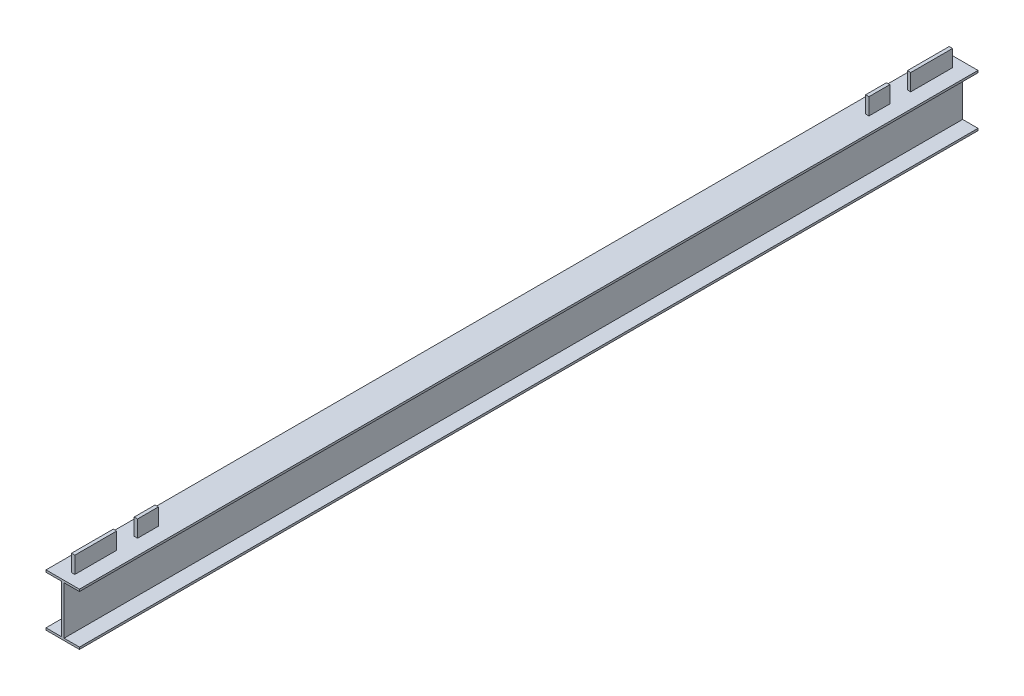
ISO-10303-21;
HEADER;
FILE_DESCRIPTION(('STEP AP214'),'2;1');
FILE_NAME('part.step','',(''),(''),'','','');
FILE_SCHEMA(('AUTOMOTIVE_DESIGN { 1 0 10303 214 1 1 1 1 }'));
ENDSEC;
DATA;
#1=APPLICATION_CONTEXT('core data for automotive mechanical design processes');
#2=APPLICATION_PROTOCOL_DEFINITION('international standard','automotive_design',2000,#1);
#3=PRODUCT_CONTEXT('',#1,'mechanical');
#4=PRODUCT('Part','Part','',(#3));
#5=PRODUCT_RELATED_PRODUCT_CATEGORY('part','',(#4));
#6=PRODUCT_DEFINITION_FORMATION('','',#4);
#7=PRODUCT_DEFINITION_CONTEXT('part definition',#1,'design');
#8=PRODUCT_DEFINITION('design','',#6,#7);
#9=PRODUCT_DEFINITION_SHAPE('','',#8);
#10=(LENGTH_UNIT() NAMED_UNIT(*) SI_UNIT(.MILLI.,.METRE.));
#11=(NAMED_UNIT(*) PLANE_ANGLE_UNIT() SI_UNIT($,.RADIAN.));
#12=(NAMED_UNIT(*) SI_UNIT($,.STERADIAN.) SOLID_ANGLE_UNIT());
#13=UNCERTAINTY_MEASURE_WITH_UNIT(LENGTH_MEASURE(1.E-05),#10,'distance_accuracy_value','');
#14=(GEOMETRIC_REPRESENTATION_CONTEXT(3) GLOBAL_UNCERTAINTY_ASSIGNED_CONTEXT((#13)) GLOBAL_UNIT_ASSIGNED_CONTEXT((#10,
#11,#12)) REPRESENTATION_CONTEXT('',''));
#15=CARTESIAN_POINT('',(0.,0.,0.));
#16=DIRECTION('',(0.,0.,1.));
#17=DIRECTION('',(1.,0.,0.));
#18=AXIS2_PLACEMENT_3D('',#15,#16,#17);
#19=CARTESIAN_POINT('',(0.,250.,4300.));
#20=DIRECTION('',(0.,-1.,0.));
#21=DIRECTION('',(0.,0.,-1.));
#22=AXIS2_PLACEMENT_3D('',#19,#20,#21);
#23=PLANE('',#22);
#24=DIRECTION('',(0.,0.,1.));
#25=VECTOR('',#24,1.);
#26=CARTESIAN_POINT('',(72.,250.,4050.));
#27=LINE('',#26,#25);
#28=CARTESIAN_POINT('',(72.,250.,4050.));
#29=VERTEX_POINT('',#28);
#30=CARTESIAN_POINT('',(72.,250.,4250.));
#31=VERTEX_POINT('',#30);
#32=EDGE_CURVE('E240',#29,#31,#27,.T.);
#33=ORIENTED_EDGE('',*,*,#32,.F.);
#34=DIRECTION('',(-1.,0.,0.));
#35=VECTOR('',#34,1.);
#36=CARTESIAN_POINT('',(72.,250.,4050.));
#37=LINE('',#36,#35);
#38=CARTESIAN_POINT('',(88.,250.,4050.));
#39=VERTEX_POINT('',#38);
#40=EDGE_CURVE('E253',#39,#29,#37,.T.);
#41=ORIENTED_EDGE('',*,*,#40,.F.);
#42=DIRECTION('',(0.,0.,-1.));
#43=VECTOR('',#42,1.);
#44=CARTESIAN_POINT('',(88.,250.,4050.));
#45=LINE('',#44,#43);
#46=CARTESIAN_POINT('',(88.,250.,4250.));
#47=VERTEX_POINT('',#46);
#48=EDGE_CURVE('E262',#47,#39,#45,.T.);
#49=ORIENTED_EDGE('',*,*,#48,.F.);
#50=DIRECTION('',(1.,0.,0.));
#51=VECTOR('',#50,1.);
#52=CARTESIAN_POINT('',(72.,250.,4250.));
#53=LINE('',#52,#51);
#54=EDGE_CURVE('E243',#31,#47,#53,.T.);
#55=ORIENTED_EDGE('',*,*,#54,.F.);
#56=EDGE_LOOP('',(#33,#41,#49,#55));
#57=FACE_BOUND('',#56,.T.);
#58=DIRECTION('',(0.,0.,1.));
#59=VECTOR('',#58,1.);
#60=CARTESIAN_POINT('',(71.9999999999996,250.,50.));
#61=LINE('',#60,#59);
#62=CARTESIAN_POINT('',(71.9999999999996,250.,50.));
#63=VERTEX_POINT('',#62);
#64=CARTESIAN_POINT('',(71.9999999999996,250.,250.));
#65=VERTEX_POINT('',#64);
#66=EDGE_CURVE('E311',#63,#65,#61,.T.);
#67=ORIENTED_EDGE('',*,*,#66,.F.);
#68=DIRECTION('',(-1.,0.,0.));
#69=VECTOR('',#68,1.);
#70=CARTESIAN_POINT('',(71.9999999999996,250.,50.));
#71=LINE('',#70,#69);
#72=CARTESIAN_POINT('',(88.0000000000004,250.,49.9999999999998));
#73=VERTEX_POINT('',#72);
#74=EDGE_CURVE('E316',#73,#63,#71,.T.);
#75=ORIENTED_EDGE('',*,*,#74,.F.);
#76=DIRECTION('',(0.,0.,-1.));
#77=VECTOR('',#76,1.);
#78=CARTESIAN_POINT('',(88.0000000000004,250.,50.));
#79=LINE('',#78,#77);
#80=CARTESIAN_POINT('',(88.0000000000004,250.,250.));
#81=VERTEX_POINT('',#80);
#82=EDGE_CURVE('E328',#81,#73,#79,.T.);
#83=ORIENTED_EDGE('',*,*,#82,.F.);
#84=DIRECTION('',(1.,0.,0.));
#85=VECTOR('',#84,1.);
#86=CARTESIAN_POINT('',(71.9999999999996,250.,250.));
#87=LINE('',#86,#85);
#88=EDGE_CURVE('E325',#65,#81,#87,.T.);
#89=ORIENTED_EDGE('',*,*,#88,.F.);
#90=EDGE_LOOP('',(#67,#75,#83,#89));
#91=FACE_BOUND('',#90,.T.);
#92=DIRECTION('',(-1.,0.,0.));
#93=VECTOR('',#92,1.);
#94=CARTESIAN_POINT('',(0.,250.,0.));
#95=LINE('',#94,#93);
#96=CARTESIAN_POINT('',(160.,250.,0.));
#97=VERTEX_POINT('',#96);
#98=CARTESIAN_POINT('',(0.,250.,0.));
#99=VERTEX_POINT('',#98);
#100=EDGE_CURVE('E419',#97,#99,#95,.T.);
#101=ORIENTED_EDGE('',*,*,#100,.T.);
#102=DIRECTION('',(0.,0.,-1.));
#103=VECTOR('',#102,1.);
#104=CARTESIAN_POINT('',(0.,250.,4300.));
#105=LINE('',#104,#103);
#106=CARTESIAN_POINT('',(0.,250.,4300.));
#107=VERTEX_POINT('',#106);
#108=EDGE_CURVE('E409',#107,#99,#105,.T.);
#109=ORIENTED_EDGE('',*,*,#108,.F.);
#110=DIRECTION('',(-1.,0.,0.));
#111=VECTOR('',#110,1.);
#112=CARTESIAN_POINT('',(0.,250.,4300.));
#113=LINE('',#112,#111);
#114=CARTESIAN_POINT('',(160.,250.,4300.));
#115=VERTEX_POINT('',#114);
#116=EDGE_CURVE('E407',#115,#107,#113,.T.);
#117=ORIENTED_EDGE('',*,*,#116,.F.);
#118=DIRECTION('',(0.,0.,-1.));
#119=VECTOR('',#118,1.);
#120=CARTESIAN_POINT('',(160.,250.,4300.));
#121=LINE('',#120,#119);
#122=EDGE_CURVE('E423',#115,#97,#121,.T.);
#123=ORIENTED_EDGE('',*,*,#122,.T.);
#124=EDGE_LOOP('',(#101,#109,#117,#123));
#125=FACE_BOUND('',#124,.T.);
#126=DIRECTION('',(0.,0.,1.));
#127=VECTOR('',#126,1.);
#128=CARTESIAN_POINT('',(71.9999999999996,250.,350.));
#129=LINE('',#128,#127);
#130=CARTESIAN_POINT('',(71.9999999999996,250.,350.));
#131=VERTEX_POINT('',#130);
#132=CARTESIAN_POINT('',(71.9999999999996,250.,450.));
#133=VERTEX_POINT('',#132);
#134=EDGE_CURVE('E278',#131,#133,#129,.T.);
#135=ORIENTED_EDGE('',*,*,#134,.F.);
#136=DIRECTION('',(-1.,0.,0.));
#137=VECTOR('',#136,1.);
#138=CARTESIAN_POINT('',(71.9999999999996,250.,350.));
#139=LINE('',#138,#137);
#140=CARTESIAN_POINT('',(88.0000000000004,250.,350.));
#141=VERTEX_POINT('',#140);
#142=EDGE_CURVE('E283',#141,#131,#139,.T.);
#143=ORIENTED_EDGE('',*,*,#142,.F.);
#144=DIRECTION('',(0.,0.,-1.));
#145=VECTOR('',#144,1.);
#146=CARTESIAN_POINT('',(88.0000000000004,250.,350.));
#147=LINE('',#146,#145);
#148=CARTESIAN_POINT('',(88.0000000000004,250.,450.));
#149=VERTEX_POINT('',#148);
#150=EDGE_CURVE('E295',#149,#141,#147,.T.);
#151=ORIENTED_EDGE('',*,*,#150,.F.);
#152=DIRECTION('',(1.,0.,0.));
#153=VECTOR('',#152,1.);
#154=CARTESIAN_POINT('',(71.9999999999996,250.,450.));
#155=LINE('',#154,#153);
#156=EDGE_CURVE('E292',#133,#149,#155,.T.);
#157=ORIENTED_EDGE('',*,*,#156,.F.);
#158=EDGE_LOOP('',(#135,#143,#151,#157));
#159=FACE_BOUND('',#158,.T.);
#160=DIRECTION('',(0.,0.,1.));
#161=VECTOR('',#160,1.);
#162=CARTESIAN_POINT('',(72.,250.,3850.));
#163=LINE('',#162,#161);
#164=CARTESIAN_POINT('',(72.,250.,3850.));
#165=VERTEX_POINT('',#164);
#166=CARTESIAN_POINT('',(72.,250.,3950.));
#167=VERTEX_POINT('',#166);
#168=EDGE_CURVE('E239',#165,#167,#163,.T.);
#169=ORIENTED_EDGE('',*,*,#168,.F.);
#170=DIRECTION('',(-1.,0.,0.));
#171=VECTOR('',#170,1.);
#172=CARTESIAN_POINT('',(72.,250.,3850.));
#173=LINE('',#172,#171);
#174=CARTESIAN_POINT('',(88.,250.,3850.));
#175=VERTEX_POINT('',#174);
#176=EDGE_CURVE('E236',#175,#165,#173,.T.);
#177=ORIENTED_EDGE('',*,*,#176,.F.);
#178=DIRECTION('',(0.,0.,-1.));
#179=VECTOR('',#178,1.);
#180=CARTESIAN_POINT('',(88.,250.,3850.));
#181=LINE('',#180,#179);
#182=CARTESIAN_POINT('',(88.,250.,3950.));
#183=VERTEX_POINT('',#182);
#184=EDGE_CURVE('E54',#183,#175,#181,.T.);
#185=ORIENTED_EDGE('',*,*,#184,.F.);
#186=DIRECTION('',(1.,0.,0.));
#187=VECTOR('',#186,1.);
#188=CARTESIAN_POINT('',(72.,250.,3950.));
#189=LINE('',#188,#187);
#190=EDGE_CURVE('E49',#167,#183,#189,.T.);
#191=ORIENTED_EDGE('',*,*,#190,.F.);
#192=EDGE_LOOP('',(#169,#177,#185,#191));
#193=FACE_BOUND('',#192,.T.);
#194=ADVANCED_FACE('F34',(#57,#91,#125,#159,#193),#23,.F.);
#195=CARTESIAN_POINT('',(0.,0.,4300.));
#196=DIRECTION('',(1.,0.,0.));
#197=DIRECTION('',(0.,0.,-1.));
#198=AXIS2_PLACEMENT_3D('',#195,#196,#197);
#199=PLANE('',#198);
#200=DIRECTION('',(0.,-1.,0.));
#201=VECTOR('',#200,1.);
#202=CARTESIAN_POINT('',(0.,0.,0.));
#203=LINE('',#202,#201);
#204=CARTESIAN_POINT('',(0.,240.,0.));
#205=VERTEX_POINT('',#204);
#206=EDGE_CURVE('E410',#99,#205,#203,.T.);
#207=ORIENTED_EDGE('',*,*,#206,.T.);
#208=DIRECTION('',(0.,0.,1.));
#209=VECTOR('',#208,1.);
#210=CARTESIAN_POINT('',(0.,240.,0.));
#211=LINE('',#210,#209);
#212=CARTESIAN_POINT('',(0.,240.,4300.));
#213=VERTEX_POINT('',#212);
#214=EDGE_CURVE('E362',#205,#213,#211,.T.);
#215=ORIENTED_EDGE('',*,*,#214,.T.);
#216=DIRECTION('',(0.,-1.,0.));
#217=VECTOR('',#216,1.);
#218=CARTESIAN_POINT('',(0.,0.,4300.));
#219=LINE('',#218,#217);
#220=EDGE_CURVE('E397',#107,#213,#219,.T.);
#221=ORIENTED_EDGE('',*,*,#220,.F.);
#222=ORIENTED_EDGE('',*,*,#108,.T.);
#223=EDGE_LOOP('',(#207,#215,#221,#222));
#224=FACE_BOUND('',#223,.T.);
#225=ADVANCED_FACE('F463',(#224),#199,.F.);
#226=CARTESIAN_POINT('',(160.,0.,4300.));
#227=DIRECTION('',(-1.,0.,0.));
#228=DIRECTION('',(0.,0.,1.));
#229=AXIS2_PLACEMENT_3D('',#226,#227,#228);
#230=PLANE('',#229);
#231=DIRECTION('',(0.,1.,0.));
#232=VECTOR('',#231,1.);
#233=CARTESIAN_POINT('',(160.,0.,0.));
#234=LINE('',#233,#232);
#235=CARTESIAN_POINT('',(160.,0.,0.));
#236=VERTEX_POINT('',#235);
#237=CARTESIAN_POINT('',(160.,10.,0.));
#238=VERTEX_POINT('',#237);
#239=EDGE_CURVE('E416',#236,#238,#234,.T.);
#240=ORIENTED_EDGE('',*,*,#239,.T.);
#241=DIRECTION('',(0.,0.,1.));
#242=VECTOR('',#241,1.);
#243=CARTESIAN_POINT('',(160.,10.,0.));
#244=LINE('',#243,#242);
#245=CARTESIAN_POINT('',(160.,10.,4300.));
#246=VERTEX_POINT('',#245);
#247=EDGE_CURVE('E388',#238,#246,#244,.T.);
#248=ORIENTED_EDGE('',*,*,#247,.T.);
#249=DIRECTION('',(0.,1.,0.));
#250=VECTOR('',#249,1.);
#251=CARTESIAN_POINT('',(160.,0.,4300.));
#252=LINE('',#251,#250);
#253=CARTESIAN_POINT('',(160.,0.,4300.));
#254=VERTEX_POINT('',#253);
#255=EDGE_CURVE('E404',#254,#246,#252,.T.);
#256=ORIENTED_EDGE('',*,*,#255,.F.);
#257=DIRECTION('',(0.,0.,-1.));
#258=VECTOR('',#257,1.);
#259=CARTESIAN_POINT('',(160.,0.,4300.));
#260=LINE('',#259,#258);
#261=EDGE_CURVE('E42',#254,#236,#260,.T.);
#262=ORIENTED_EDGE('',*,*,#261,.T.);
#263=EDGE_LOOP('',(#240,#248,#256,#262));
#264=FACE_BOUND('',#263,.T.);
#265=ADVANCED_FACE('F430',(#264),#230,.F.);
#266=CARTESIAN_POINT('',(0.,10.,4300.));
#267=VERTEX_POINT('',#266);
#268=CARTESIAN_POINT('',(0.,0.,4300.));
#269=VERTEX_POINT('',#268);
#270=EDGE_CURVE('E401',#267,#269,#219,.T.);
#271=ORIENTED_EDGE('',*,*,#270,.F.);
#272=DIRECTION('',(0.,0.,1.));
#273=VECTOR('',#272,1.);
#274=CARTESIAN_POINT('',(0.,10.,0.));
#275=LINE('',#274,#273);
#276=CARTESIAN_POINT('',(0.,10.,0.));
#277=VERTEX_POINT('',#276);
#278=EDGE_CURVE('E355',#277,#267,#275,.T.);
#279=ORIENTED_EDGE('',*,*,#278,.F.);
#280=CARTESIAN_POINT('',(0.,0.,0.));
#281=VERTEX_POINT('',#280);
#282=EDGE_CURVE('E391',#277,#281,#203,.T.);
#283=ORIENTED_EDGE('',*,*,#282,.T.);
#284=DIRECTION('',(0.,0.,-1.));
#285=VECTOR('',#284,1.);
#286=CARTESIAN_POINT('',(0.,0.,4300.));
#287=LINE('',#286,#285);
#288=EDGE_CURVE('E11',#269,#281,#287,.T.);
#289=ORIENTED_EDGE('',*,*,#288,.F.);
#290=EDGE_LOOP('',(#271,#279,#283,#289));
#291=FACE_BOUND('',#290,.T.);
#292=ADVANCED_FACE('F36',(#291),#199,.F.);
#293=CARTESIAN_POINT('',(0.,0.,4300.));
#294=DIRECTION('',(0.,1.,0.));
#295=DIRECTION('',(0.,0.,1.));
#296=AXIS2_PLACEMENT_3D('',#293,#294,#295);
#297=PLANE('',#296);
#298=DIRECTION('',(1.,0.,0.));
#299=VECTOR('',#298,1.);
#300=CARTESIAN_POINT('',(0.,0.,0.));
#301=LINE('',#300,#299);
#302=EDGE_CURVE('E413',#281,#236,#301,.T.);
#303=ORIENTED_EDGE('',*,*,#302,.T.);
#304=ORIENTED_EDGE('',*,*,#261,.F.);
#305=DIRECTION('',(1.,0.,0.));
#306=VECTOR('',#305,1.);
#307=CARTESIAN_POINT('',(0.,0.,4300.));
#308=LINE('',#307,#306);
#309=EDGE_CURVE('E400',#269,#254,#308,.T.);
#310=ORIENTED_EDGE('',*,*,#309,.F.);
#311=ORIENTED_EDGE('',*,*,#288,.T.);
#312=EDGE_LOOP('',(#303,#304,#310,#311));
#313=FACE_BOUND('',#312,.T.);
#314=ADVANCED_FACE('F447',(#313),#297,.F.);
#315=CARTESIAN_POINT('',(160.,240.,4300.));
#316=VERTEX_POINT('',#315);
#317=EDGE_CURVE('E403',#316,#115,#252,.T.);
#318=ORIENTED_EDGE('',*,*,#317,.F.);
#319=DIRECTION('',(0.,0.,1.));
#320=VECTOR('',#319,1.);
#321=CARTESIAN_POINT('',(160.,240.,0.));
#322=LINE('',#321,#320);
#323=CARTESIAN_POINT('',(160.,240.,0.));
#324=VERTEX_POINT('',#323);
#325=EDGE_CURVE('E381',#324,#316,#322,.T.);
#326=ORIENTED_EDGE('',*,*,#325,.F.);
#327=EDGE_CURVE('E415',#324,#97,#234,.T.);
#328=ORIENTED_EDGE('',*,*,#327,.T.);
#329=ORIENTED_EDGE('',*,*,#122,.F.);
#330=EDGE_LOOP('',(#318,#326,#328,#329));
#331=FACE_BOUND('',#330,.T.);
#332=ADVANCED_FACE('F474',(#331),#230,.F.);
#333=CARTESIAN_POINT('',(0.,0.,4300.));
#334=DIRECTION('',(0.,0.,-1.));
#335=DIRECTION('',(-1.,0.,0.));
#336=AXIS2_PLACEMENT_3D('',#333,#334,#335);
#337=PLANE('',#336);
#338=ORIENTED_EDGE('',*,*,#220,.T.);
#339=DIRECTION('',(-1.,0.,0.));
#340=VECTOR('',#339,1.);
#341=CARTESIAN_POINT('',(0.,240.,4300.));
#342=LINE('',#341,#340);
#343=CARTESIAN_POINT('',(73.5,240.,4300.));
#344=VERTEX_POINT('',#343);
#345=EDGE_CURVE('E349',#344,#213,#342,.T.);
#346=ORIENTED_EDGE('',*,*,#345,.F.);
#347=DIRECTION('',(0.,1.,0.));
#348=VECTOR('',#347,1.);
#349=CARTESIAN_POINT('',(73.5,240.,4300.));
#350=LINE('',#349,#348);
#351=CARTESIAN_POINT('',(73.5,10.0000000000001,4300.));
#352=VERTEX_POINT('',#351);
#353=EDGE_CURVE('E358',#352,#344,#350,.T.);
#354=ORIENTED_EDGE('',*,*,#353,.F.);
#355=DIRECTION('',(1.,0.,0.));
#356=VECTOR('',#355,1.);
#357=CARTESIAN_POINT('',(0.,10.,4300.));
#358=LINE('',#357,#356);
#359=EDGE_CURVE('E344',#267,#352,#358,.T.);
#360=ORIENTED_EDGE('',*,*,#359,.F.);
#361=ORIENTED_EDGE('',*,*,#270,.T.);
#362=ORIENTED_EDGE('',*,*,#309,.T.);
#363=ORIENTED_EDGE('',*,*,#255,.T.);
#364=DIRECTION('',(1.,0.,0.));
#365=VECTOR('',#364,1.);
#366=CARTESIAN_POINT('',(160.,10.,4300.));
#367=LINE('',#366,#365);
#368=CARTESIAN_POINT('',(86.5,10.0000000000001,4300.));
#369=VERTEX_POINT('',#368);
#370=EDGE_CURVE('E375',#369,#246,#367,.T.);
#371=ORIENTED_EDGE('',*,*,#370,.F.);
#372=DIRECTION('',(0.,-1.,0.));
#373=VECTOR('',#372,1.);
#374=CARTESIAN_POINT('',(86.5,240.,4300.));
#375=LINE('',#374,#373);
#376=CARTESIAN_POINT('',(86.5,240.,4300.));
#377=VERTEX_POINT('',#376);
#378=EDGE_CURVE('E384',#377,#369,#375,.T.);
#379=ORIENTED_EDGE('',*,*,#378,.F.);
#380=DIRECTION('',(-1.,0.,0.));
#381=VECTOR('',#380,1.);
#382=CARTESIAN_POINT('',(160.,240.,4300.));
#383=LINE('',#382,#381);
#384=EDGE_CURVE('E365',#316,#377,#383,.T.);
#385=ORIENTED_EDGE('',*,*,#384,.F.);
#386=ORIENTED_EDGE('',*,*,#317,.T.);
#387=ORIENTED_EDGE('',*,*,#116,.T.);
#388=EDGE_LOOP('',(#338,#346,#354,#360,#361,#362,#363,#371,#379,#385,#386,#387));
#389=FACE_BOUND('',#388,.T.);
#390=ADVANCED_FACE('F442',(#389),#337,.F.);
#391=CARTESIAN_POINT('',(0.,0.,0.));
#392=DIRECTION('',(0.,0.,-1.));
#393=DIRECTION('',(-1.,0.,0.));
#394=AXIS2_PLACEMENT_3D('',#391,#392,#393);
#395=PLANE('',#394);
#396=DIRECTION('',(-1.,0.,0.));
#397=VECTOR('',#396,1.);
#398=CARTESIAN_POINT('',(0.,240.,0.));
#399=LINE('',#398,#397);
#400=CARTESIAN_POINT('',(73.5,240.,0.));
#401=VERTEX_POINT('',#400);
#402=EDGE_CURVE('E352',#401,#205,#399,.T.);
#403=ORIENTED_EDGE('',*,*,#402,.T.);
#404=ORIENTED_EDGE('',*,*,#206,.F.);
#405=ORIENTED_EDGE('',*,*,#100,.F.);
#406=ORIENTED_EDGE('',*,*,#327,.F.);
#407=DIRECTION('',(-1.,0.,0.));
#408=VECTOR('',#407,1.);
#409=CARTESIAN_POINT('',(160.,240.,0.));
#410=LINE('',#409,#408);
#411=CARTESIAN_POINT('',(86.5,240.,0.));
#412=VERTEX_POINT('',#411);
#413=EDGE_CURVE('E371',#324,#412,#410,.T.);
#414=ORIENTED_EDGE('',*,*,#413,.T.);
#415=DIRECTION('',(0.,-1.,0.));
#416=VECTOR('',#415,1.);
#417=CARTESIAN_POINT('',(86.5,240.,0.));
#418=LINE('',#417,#416);
#419=CARTESIAN_POINT('',(86.5,10.0000000000001,0.));
#420=VERTEX_POINT('',#419);
#421=EDGE_CURVE('E374',#412,#420,#418,.T.);
#422=ORIENTED_EDGE('',*,*,#421,.T.);
#423=DIRECTION('',(1.,0.,0.));
#424=VECTOR('',#423,1.);
#425=CARTESIAN_POINT('',(160.,10.,0.));
#426=LINE('',#425,#424);
#427=EDGE_CURVE('E378',#420,#238,#426,.T.);
#428=ORIENTED_EDGE('',*,*,#427,.T.);
#429=ORIENTED_EDGE('',*,*,#239,.F.);
#430=ORIENTED_EDGE('',*,*,#302,.F.);
#431=ORIENTED_EDGE('',*,*,#282,.F.);
#432=DIRECTION('',(1.,0.,0.));
#433=VECTOR('',#432,1.);
#434=CARTESIAN_POINT('',(0.,10.,0.));
#435=LINE('',#434,#433);
#436=CARTESIAN_POINT('',(73.5,10.0000000000001,0.));
#437=VERTEX_POINT('',#436);
#438=EDGE_CURVE('E345',#277,#437,#435,.T.);
#439=ORIENTED_EDGE('',*,*,#438,.T.);
#440=DIRECTION('',(0.,1.,0.));
#441=VECTOR('',#440,1.);
#442=CARTESIAN_POINT('',(73.5,240.,0.));
#443=LINE('',#442,#441);
#444=EDGE_CURVE('E348',#437,#401,#443,.T.);
#445=ORIENTED_EDGE('',*,*,#444,.T.);
#446=EDGE_LOOP('',(#403,#404,#405,#406,#414,#422,#428,#429,#430,#431,#439,#445));
#447=FACE_BOUND('',#446,.T.);
#448=ADVANCED_FACE('F435',(#447),#395,.T.);
#449=CARTESIAN_POINT('',(160.,10.,0.));
#450=DIRECTION('',(0.,-1.,0.));
#451=DIRECTION('',(1.,0.,0.));
#452=AXIS2_PLACEMENT_3D('',#449,#450,#451);
#453=PLANE('',#452);
#454=ORIENTED_EDGE('',*,*,#370,.T.);
#455=ORIENTED_EDGE('',*,*,#247,.F.);
#456=ORIENTED_EDGE('',*,*,#427,.F.);
#457=DIRECTION('',(0.,0.,1.));
#458=VECTOR('',#457,1.);
#459=CARTESIAN_POINT('',(86.5,10.0000000000001,0.));
#460=LINE('',#459,#458);
#461=EDGE_CURVE('E392',#420,#369,#460,.T.);
#462=ORIENTED_EDGE('',*,*,#461,.T.);
#463=EDGE_LOOP('',(#454,#455,#456,#462));
#464=FACE_BOUND('',#463,.T.);
#465=ADVANCED_FACE('F439',(#464),#453,.F.);
#466=CARTESIAN_POINT('',(86.5,240.,0.));
#467=DIRECTION('',(-1.,0.,0.));
#468=DIRECTION('',(0.,0.,1.));
#469=AXIS2_PLACEMENT_3D('',#466,#467,#468);
#470=PLANE('',#469);
#471=ORIENTED_EDGE('',*,*,#378,.T.);
#472=ORIENTED_EDGE('',*,*,#461,.F.);
#473=ORIENTED_EDGE('',*,*,#421,.F.);
#474=DIRECTION('',(0.,0.,1.));
#475=VECTOR('',#474,1.);
#476=CARTESIAN_POINT('',(86.5,240.,0.));
#477=LINE('',#476,#475);
#478=EDGE_CURVE('E394',#412,#377,#477,.T.);
#479=ORIENTED_EDGE('',*,*,#478,.T.);
#480=EDGE_LOOP('',(#471,#472,#473,#479));
#481=FACE_BOUND('',#480,.T.);
#482=ADVANCED_FACE('F480',(#481),#470,.F.);
#483=CARTESIAN_POINT('',(160.,240.,0.));
#484=DIRECTION('',(0.,1.,0.));
#485=DIRECTION('',(-1.,0.,0.));
#486=AXIS2_PLACEMENT_3D('',#483,#484,#485);
#487=PLANE('',#486);
#488=ORIENTED_EDGE('',*,*,#384,.T.);
#489=ORIENTED_EDGE('',*,*,#478,.F.);
#490=ORIENTED_EDGE('',*,*,#413,.F.);
#491=ORIENTED_EDGE('',*,*,#325,.T.);
#492=EDGE_LOOP('',(#488,#489,#490,#491));
#493=FACE_BOUND('',#492,.T.);
#494=ADVANCED_FACE('F477',(#493),#487,.F.);
#495=CARTESIAN_POINT('',(0.,240.,0.));
#496=DIRECTION('',(0.,1.,0.));
#497=DIRECTION('',(-1.,0.,0.));
#498=AXIS2_PLACEMENT_3D('',#495,#496,#497);
#499=PLANE('',#498);
#500=ORIENTED_EDGE('',*,*,#345,.T.);
#501=ORIENTED_EDGE('',*,*,#214,.F.);
#502=ORIENTED_EDGE('',*,*,#402,.F.);
#503=DIRECTION('',(0.,0.,1.));
#504=VECTOR('',#503,1.);
#505=CARTESIAN_POINT('',(73.5,240.,0.));
#506=LINE('',#505,#504);
#507=EDGE_CURVE('E366',#401,#344,#506,.T.);
#508=ORIENTED_EDGE('',*,*,#507,.T.);
#509=EDGE_LOOP('',(#500,#501,#502,#508));
#510=FACE_BOUND('',#509,.T.);
#511=ADVANCED_FACE('F459',(#510),#499,.F.);
#512=CARTESIAN_POINT('',(73.5,240.,0.));
#513=DIRECTION('',(1.,0.,0.));
#514=DIRECTION('',(0.,0.,-1.));
#515=AXIS2_PLACEMENT_3D('',#512,#513,#514);
#516=PLANE('',#515);
#517=ORIENTED_EDGE('',*,*,#353,.T.);
#518=ORIENTED_EDGE('',*,*,#507,.F.);
#519=ORIENTED_EDGE('',*,*,#444,.F.);
#520=DIRECTION('',(0.,0.,1.));
#521=VECTOR('',#520,1.);
#522=CARTESIAN_POINT('',(73.5,10.0000000000001,0.));
#523=LINE('',#522,#521);
#524=EDGE_CURVE('E368',#437,#352,#523,.T.);
#525=ORIENTED_EDGE('',*,*,#524,.T.);
#526=EDGE_LOOP('',(#517,#518,#519,#525));
#527=FACE_BOUND('',#526,.T.);
#528=ADVANCED_FACE('F455',(#527),#516,.F.);
#529=CARTESIAN_POINT('',(0.,10.,0.));
#530=DIRECTION('',(0.,-1.,0.));
#531=DIRECTION('',(1.,0.,0.));
#532=AXIS2_PLACEMENT_3D('',#529,#530,#531);
#533=PLANE('',#532);
#534=ORIENTED_EDGE('',*,*,#359,.T.);
#535=ORIENTED_EDGE('',*,*,#524,.F.);
#536=ORIENTED_EDGE('',*,*,#438,.F.);
#537=ORIENTED_EDGE('',*,*,#278,.T.);
#538=EDGE_LOOP('',(#534,#535,#536,#537));
#539=FACE_BOUND('',#538,.T.);
#540=ADVANCED_FACE('F452',(#539),#533,.F.);
#541=CARTESIAN_POINT('',(71.9999999999996,330.,50.));
#542=DIRECTION('',(1.,0.,0.));
#543=DIRECTION('',(0.,0.,-1.));
#544=AXIS2_PLACEMENT_3D('',#541,#542,#543);
#545=PLANE('',#544);
#546=ORIENTED_EDGE('',*,*,#66,.T.);
#547=DIRECTION('',(0.,-1.,0.));
#548=VECTOR('',#547,1.);
#549=CARTESIAN_POINT('',(71.9999999999996,330.,250.));
#550=LINE('',#549,#548);
#551=CARTESIAN_POINT('',(71.9999999999996,330.,250.));
#552=VERTEX_POINT('',#551);
#553=EDGE_CURVE('E341',#552,#65,#550,.T.);
#554=ORIENTED_EDGE('',*,*,#553,.F.);
#555=DIRECTION('',(0.,0.,1.));
#556=VECTOR('',#555,1.);
#557=CARTESIAN_POINT('',(71.9999999999996,330.,50.));
#558=LINE('',#557,#556);
#559=CARTESIAN_POINT('',(71.9999999999996,330.,50.));
#560=VERTEX_POINT('',#559);
#561=EDGE_CURVE('E312',#560,#552,#558,.T.);
#562=ORIENTED_EDGE('',*,*,#561,.F.);
#563=DIRECTION('',(0.,-1.,0.));
#564=VECTOR('',#563,1.);
#565=CARTESIAN_POINT('',(71.9999999999996,330.,50.));
#566=LINE('',#565,#564);
#567=EDGE_CURVE('E322',#560,#63,#566,.T.);
#568=ORIENTED_EDGE('',*,*,#567,.T.);
#569=EDGE_LOOP('',(#546,#554,#562,#568));
#570=FACE_BOUND('',#569,.T.);
#571=ADVANCED_FACE('F580',(#570),#545,.F.);
#572=CARTESIAN_POINT('',(71.9999999999996,330.,250.));
#573=DIRECTION('',(0.,0.,-1.));
#574=DIRECTION('',(-1.,0.,0.));
#575=AXIS2_PLACEMENT_3D('',#572,#573,#574);
#576=PLANE('',#575);
#577=ORIENTED_EDGE('',*,*,#88,.T.);
#578=DIRECTION('',(0.,-1.,0.));
#579=VECTOR('',#578,1.);
#580=CARTESIAN_POINT('',(88.0000000000004,330.,250.));
#581=LINE('',#580,#579);
#582=CARTESIAN_POINT('',(88.0000000000004,330.,250.));
#583=VERTEX_POINT('',#582);
#584=EDGE_CURVE('E338',#583,#81,#581,.T.);
#585=ORIENTED_EDGE('',*,*,#584,.F.);
#586=DIRECTION('',(1.,0.,0.));
#587=VECTOR('',#586,1.);
#588=CARTESIAN_POINT('',(71.9999999999996,330.,250.));
#589=LINE('',#588,#587);
#590=EDGE_CURVE('E315',#552,#583,#589,.T.);
#591=ORIENTED_EDGE('',*,*,#590,.F.);
#592=ORIENTED_EDGE('',*,*,#553,.T.);
#593=EDGE_LOOP('',(#577,#585,#591,#592));
#594=FACE_BOUND('',#593,.T.);
#595=ADVANCED_FACE('F594',(#594),#576,.F.);
#596=CARTESIAN_POINT('',(88.0000000000004,330.,50.));
#597=DIRECTION('',(-1.,0.,0.));
#598=DIRECTION('',(0.,0.,1.));
#599=AXIS2_PLACEMENT_3D('',#596,#597,#598);
#600=PLANE('',#599);
#601=ORIENTED_EDGE('',*,*,#82,.T.);
#602=DIRECTION('',(0.,-1.,0.));
#603=VECTOR('',#602,1.);
#604=CARTESIAN_POINT('',(88.0000000000004,330.,50.));
#605=LINE('',#604,#603);
#606=CARTESIAN_POINT('',(88.0000000000004,330.,50.));
#607=VERTEX_POINT('',#606);
#608=EDGE_CURVE('E335',#607,#73,#605,.T.);
#609=ORIENTED_EDGE('',*,*,#608,.F.);
#610=DIRECTION('',(0.,0.,-1.));
#611=VECTOR('',#610,1.);
#612=CARTESIAN_POINT('',(88.0000000000004,330.,50.));
#613=LINE('',#612,#611);
#614=EDGE_CURVE('E318',#583,#607,#613,.T.);
#615=ORIENTED_EDGE('',*,*,#614,.F.);
#616=ORIENTED_EDGE('',*,*,#584,.T.);
#617=EDGE_LOOP('',(#601,#609,#615,#616));
#618=FACE_BOUND('',#617,.T.);
#619=ADVANCED_FACE('F604',(#618),#600,.F.);
#620=CARTESIAN_POINT('',(71.9999999999996,330.,50.));
#621=DIRECTION('',(0.,0.,1.));
#622=DIRECTION('',(1.,0.,0.));
#623=AXIS2_PLACEMENT_3D('',#620,#621,#622);
#624=PLANE('',#623);
#625=ORIENTED_EDGE('',*,*,#74,.T.);
#626=ORIENTED_EDGE('',*,*,#567,.F.);
#627=DIRECTION('',(-1.,0.,0.));
#628=VECTOR('',#627,1.);
#629=CARTESIAN_POINT('',(71.9999999999996,330.,50.));
#630=LINE('',#629,#628);
#631=EDGE_CURVE('E320',#607,#560,#630,.T.);
#632=ORIENTED_EDGE('',*,*,#631,.F.);
#633=ORIENTED_EDGE('',*,*,#608,.T.);
#634=EDGE_LOOP('',(#625,#626,#632,#633));
#635=FACE_BOUND('',#634,.T.);
#636=ADVANCED_FACE('F614',(#635),#624,.F.);
#637=CARTESIAN_POINT('',(0.,330.,0.));
#638=DIRECTION('',(0.,1.,0.));
#639=DIRECTION('',(0.,0.,1.));
#640=AXIS2_PLACEMENT_3D('',#637,#638,#639);
#641=PLANE('',#640);
#642=ORIENTED_EDGE('',*,*,#561,.T.);
#643=ORIENTED_EDGE('',*,*,#590,.T.);
#644=ORIENTED_EDGE('',*,*,#614,.T.);
#645=ORIENTED_EDGE('',*,*,#631,.T.);
#646=EDGE_LOOP('',(#642,#643,#644,#645));
#647=FACE_BOUND('',#646,.T.);
#648=ADVANCED_FACE('F624',(#647),#641,.T.);
#649=CARTESIAN_POINT('',(71.9999999999996,330.,350.));
#650=DIRECTION('',(1.,0.,0.));
#651=DIRECTION('',(0.,0.,-1.));
#652=AXIS2_PLACEMENT_3D('',#649,#650,#651);
#653=PLANE('',#652);
#654=ORIENTED_EDGE('',*,*,#134,.T.);
#655=DIRECTION('',(0.,-1.,0.));
#656=VECTOR('',#655,1.);
#657=CARTESIAN_POINT('',(71.9999999999996,330.,450.));
#658=LINE('',#657,#656);
#659=CARTESIAN_POINT('',(71.9999999999996,330.,450.));
#660=VERTEX_POINT('',#659);
#661=EDGE_CURVE('E308',#660,#133,#658,.T.);
#662=ORIENTED_EDGE('',*,*,#661,.F.);
#663=DIRECTION('',(0.,0.,1.));
#664=VECTOR('',#663,1.);
#665=CARTESIAN_POINT('',(71.9999999999996,330.,350.));
#666=LINE('',#665,#664);
#667=CARTESIAN_POINT('',(71.9999999999996,330.,350.));
#668=VERTEX_POINT('',#667);
#669=EDGE_CURVE('E279',#668,#660,#666,.T.);
#670=ORIENTED_EDGE('',*,*,#669,.F.);
#671=DIRECTION('',(0.,-1.,0.));
#672=VECTOR('',#671,1.);
#673=CARTESIAN_POINT('',(71.9999999999996,330.,350.));
#674=LINE('',#673,#672);
#675=EDGE_CURVE('E289',#668,#131,#674,.T.);
#676=ORIENTED_EDGE('',*,*,#675,.T.);
#677=EDGE_LOOP('',(#654,#662,#670,#676));
#678=FACE_BOUND('',#677,.T.);
#679=ADVANCED_FACE('F634',(#678),#653,.F.);
#680=CARTESIAN_POINT('',(71.9999999999996,330.,450.));
#681=DIRECTION('',(0.,0.,-1.));
#682=DIRECTION('',(-1.,0.,0.));
#683=AXIS2_PLACEMENT_3D('',#680,#681,#682);
#684=PLANE('',#683);
#685=ORIENTED_EDGE('',*,*,#156,.T.);
#686=DIRECTION('',(0.,-1.,0.));
#687=VECTOR('',#686,1.);
#688=CARTESIAN_POINT('',(88.0000000000004,330.,450.));
#689=LINE('',#688,#687);
#690=CARTESIAN_POINT('',(88.0000000000004,330.,450.));
#691=VERTEX_POINT('',#690);
#692=EDGE_CURVE('E305',#691,#149,#689,.T.);
#693=ORIENTED_EDGE('',*,*,#692,.F.);
#694=DIRECTION('',(1.,0.,0.));
#695=VECTOR('',#694,1.);
#696=CARTESIAN_POINT('',(71.9999999999996,330.,450.));
#697=LINE('',#696,#695);
#698=EDGE_CURVE('E282',#660,#691,#697,.T.);
#699=ORIENTED_EDGE('',*,*,#698,.F.);
#700=ORIENTED_EDGE('',*,*,#661,.T.);
#701=EDGE_LOOP('',(#685,#693,#699,#700));
#702=FACE_BOUND('',#701,.T.);
#703=ADVANCED_FACE('F644',(#702),#684,.F.);
#704=CARTESIAN_POINT('',(88.0000000000004,330.,350.));
#705=DIRECTION('',(-1.,0.,0.));
#706=DIRECTION('',(0.,0.,1.));
#707=AXIS2_PLACEMENT_3D('',#704,#705,#706);
#708=PLANE('',#707);
#709=ORIENTED_EDGE('',*,*,#150,.T.);
#710=DIRECTION('',(0.,-1.,0.));
#711=VECTOR('',#710,1.);
#712=CARTESIAN_POINT('',(88.0000000000004,330.,350.));
#713=LINE('',#712,#711);
#714=CARTESIAN_POINT('',(88.0000000000004,330.,350.));
#715=VERTEX_POINT('',#714);
#716=EDGE_CURVE('E302',#715,#141,#713,.T.);
#717=ORIENTED_EDGE('',*,*,#716,.F.);
#718=DIRECTION('',(0.,0.,-1.));
#719=VECTOR('',#718,1.);
#720=CARTESIAN_POINT('',(88.0000000000004,330.,350.));
#721=LINE('',#720,#719);
#722=EDGE_CURVE('E285',#691,#715,#721,.T.);
#723=ORIENTED_EDGE('',*,*,#722,.F.);
#724=ORIENTED_EDGE('',*,*,#692,.T.);
#725=EDGE_LOOP('',(#709,#717,#723,#724));
#726=FACE_BOUND('',#725,.T.);
#727=ADVANCED_FACE('F654',(#726),#708,.F.);
#728=CARTESIAN_POINT('',(71.9999999999996,330.,350.));
#729=DIRECTION('',(0.,0.,1.));
#730=DIRECTION('',(1.,0.,0.));
#731=AXIS2_PLACEMENT_3D('',#728,#729,#730);
#732=PLANE('',#731);
#733=ORIENTED_EDGE('',*,*,#142,.T.);
#734=ORIENTED_EDGE('',*,*,#675,.F.);
#735=DIRECTION('',(-1.,0.,0.));
#736=VECTOR('',#735,1.);
#737=CARTESIAN_POINT('',(71.9999999999996,330.,350.));
#738=LINE('',#737,#736);
#739=EDGE_CURVE('E287',#715,#668,#738,.T.);
#740=ORIENTED_EDGE('',*,*,#739,.F.);
#741=ORIENTED_EDGE('',*,*,#716,.T.);
#742=EDGE_LOOP('',(#733,#734,#740,#741));
#743=FACE_BOUND('',#742,.T.);
#744=ADVANCED_FACE('F664',(#743),#732,.F.);
#745=CARTESIAN_POINT('',(0.,330.,0.));
#746=DIRECTION('',(0.,1.,0.));
#747=DIRECTION('',(0.,0.,1.));
#748=AXIS2_PLACEMENT_3D('',#745,#746,#747);
#749=PLANE('',#748);
#750=ORIENTED_EDGE('',*,*,#669,.T.);
#751=ORIENTED_EDGE('',*,*,#698,.T.);
#752=ORIENTED_EDGE('',*,*,#722,.T.);
#753=ORIENTED_EDGE('',*,*,#739,.T.);
#754=EDGE_LOOP('',(#750,#751,#752,#753));
#755=FACE_BOUND('',#754,.T.);
#756=ADVANCED_FACE('F674',(#755),#749,.T.);
#757=CARTESIAN_POINT('',(72.,330.,4050.));
#758=DIRECTION('',(1.,0.,0.));
#759=DIRECTION('',(0.,0.,-1.));
#760=AXIS2_PLACEMENT_3D('',#757,#758,#759);
#761=PLANE('',#760);
#762=ORIENTED_EDGE('',*,*,#32,.T.);
#763=DIRECTION('',(0.,-1.,0.));
#764=VECTOR('',#763,1.);
#765=CARTESIAN_POINT('',(72.,330.,4250.));
#766=LINE('',#765,#764);
#767=CARTESIAN_POINT('',(72.,330.,4250.));
#768=VERTEX_POINT('',#767);
#769=EDGE_CURVE('E275',#768,#31,#766,.T.);
#770=ORIENTED_EDGE('',*,*,#769,.F.);
#771=DIRECTION('',(0.,0.,1.));
#772=VECTOR('',#771,1.);
#773=CARTESIAN_POINT('',(72.,330.,4050.));
#774=LINE('',#773,#772);
#775=CARTESIAN_POINT('',(72.,330.,4050.));
#776=VERTEX_POINT('',#775);
#777=EDGE_CURVE('E249',#776,#768,#774,.T.);
#778=ORIENTED_EDGE('',*,*,#777,.F.);
#779=DIRECTION('',(0.,-1.,0.));
#780=VECTOR('',#779,1.);
#781=CARTESIAN_POINT('',(72.,330.,4050.));
#782=LINE('',#781,#780);
#783=EDGE_CURVE('E258',#776,#29,#782,.T.);
#784=ORIENTED_EDGE('',*,*,#783,.T.);
#785=EDGE_LOOP('',(#762,#770,#778,#784));
#786=FACE_BOUND('',#785,.T.);
#787=ADVANCED_FACE('F684',(#786),#761,.F.);
#788=CARTESIAN_POINT('',(72.,330.,4250.));
#789=DIRECTION('',(0.,0.,-1.));
#790=DIRECTION('',(-1.,0.,0.));
#791=AXIS2_PLACEMENT_3D('',#788,#789,#790);
#792=PLANE('',#791);
#793=ORIENTED_EDGE('',*,*,#54,.T.);
#794=DIRECTION('',(0.,-1.,0.));
#795=VECTOR('',#794,1.);
#796=CARTESIAN_POINT('',(88.,330.,4250.));
#797=LINE('',#796,#795);
#798=CARTESIAN_POINT('',(88.,330.,4250.));
#799=VERTEX_POINT('',#798);
#800=EDGE_CURVE('E272',#799,#47,#797,.T.);
#801=ORIENTED_EDGE('',*,*,#800,.F.);
#802=DIRECTION('',(1.,0.,0.));
#803=VECTOR('',#802,1.);
#804=CARTESIAN_POINT('',(72.,330.,4250.));
#805=LINE('',#804,#803);
#806=EDGE_CURVE('E252',#768,#799,#805,.T.);
#807=ORIENTED_EDGE('',*,*,#806,.F.);
#808=ORIENTED_EDGE('',*,*,#769,.T.);
#809=EDGE_LOOP('',(#793,#801,#807,#808));
#810=FACE_BOUND('',#809,.T.);
#811=ADVANCED_FACE('F694',(#810),#792,.F.);
#812=CARTESIAN_POINT('',(88.,330.,4050.));
#813=DIRECTION('',(-1.,0.,0.));
#814=DIRECTION('',(0.,0.,1.));
#815=AXIS2_PLACEMENT_3D('',#812,#813,#814);
#816=PLANE('',#815);
#817=ORIENTED_EDGE('',*,*,#48,.T.);
#818=DIRECTION('',(0.,-1.,0.));
#819=VECTOR('',#818,1.);
#820=CARTESIAN_POINT('',(88.,330.,4050.));
#821=LINE('',#820,#819);
#822=CARTESIAN_POINT('',(88.,330.,4050.));
#823=VERTEX_POINT('',#822);
#824=EDGE_CURVE('E269',#823,#39,#821,.T.);
#825=ORIENTED_EDGE('',*,*,#824,.F.);
#826=DIRECTION('',(0.,0.,-1.));
#827=VECTOR('',#826,1.);
#828=CARTESIAN_POINT('',(88.,330.,4050.));
#829=LINE('',#828,#827);
#830=EDGE_CURVE('E255',#799,#823,#829,.T.);
#831=ORIENTED_EDGE('',*,*,#830,.F.);
#832=ORIENTED_EDGE('',*,*,#800,.T.);
#833=EDGE_LOOP('',(#817,#825,#831,#832));
#834=FACE_BOUND('',#833,.T.);
#835=ADVANCED_FACE('F704',(#834),#816,.F.);
#836=CARTESIAN_POINT('',(72.,330.,4050.));
#837=DIRECTION('',(0.,0.,1.));
#838=DIRECTION('',(1.,0.,0.));
#839=AXIS2_PLACEMENT_3D('',#836,#837,#838);
#840=PLANE('',#839);
#841=ORIENTED_EDGE('',*,*,#40,.T.);
#842=ORIENTED_EDGE('',*,*,#783,.F.);
#843=DIRECTION('',(-1.,0.,0.));
#844=VECTOR('',#843,1.);
#845=CARTESIAN_POINT('',(72.,330.,4050.));
#846=LINE('',#845,#844);
#847=EDGE_CURVE('E257',#823,#776,#846,.T.);
#848=ORIENTED_EDGE('',*,*,#847,.F.);
#849=ORIENTED_EDGE('',*,*,#824,.T.);
#850=EDGE_LOOP('',(#841,#842,#848,#849));
#851=FACE_BOUND('',#850,.T.);
#852=ADVANCED_FACE('F714',(#851),#840,.F.);
#853=CARTESIAN_POINT('',(0.,330.,0.));
#854=DIRECTION('',(0.,1.,0.));
#855=DIRECTION('',(0.,0.,1.));
#856=AXIS2_PLACEMENT_3D('',#853,#854,#855);
#857=PLANE('',#856);
#858=ORIENTED_EDGE('',*,*,#777,.T.);
#859=ORIENTED_EDGE('',*,*,#806,.T.);
#860=ORIENTED_EDGE('',*,*,#830,.T.);
#861=ORIENTED_EDGE('',*,*,#847,.T.);
#862=EDGE_LOOP('',(#858,#859,#860,#861));
#863=FACE_BOUND('',#862,.T.);
#864=ADVANCED_FACE('F724',(#863),#857,.T.);
#865=CARTESIAN_POINT('',(72.,330.,3850.));
#866=DIRECTION('',(1.,0.,0.));
#867=DIRECTION('',(0.,0.,-1.));
#868=AXIS2_PLACEMENT_3D('',#865,#866,#867);
#869=PLANE('',#868);
#870=ORIENTED_EDGE('',*,*,#168,.T.);
#871=DIRECTION('',(0.,-1.,0.));
#872=VECTOR('',#871,1.);
#873=CARTESIAN_POINT('',(72.,330.,3950.));
#874=LINE('',#873,#872);
#875=CARTESIAN_POINT('',(72.,330.,3950.));
#876=VERTEX_POINT('',#875);
#877=EDGE_CURVE('E220',#876,#167,#874,.T.);
#878=ORIENTED_EDGE('',*,*,#877,.F.);
#879=DIRECTION('',(0.,0.,1.));
#880=VECTOR('',#879,1.);
#881=CARTESIAN_POINT('',(72.,330.,3850.));
#882=LINE('',#881,#880);
#883=CARTESIAN_POINT('',(72.,330.,3850.));
#884=VERTEX_POINT('',#883);
#885=EDGE_CURVE('E227',#884,#876,#882,.T.);
#886=ORIENTED_EDGE('',*,*,#885,.F.);
#887=DIRECTION('',(0.,-1.,0.));
#888=VECTOR('',#887,1.);
#889=CARTESIAN_POINT('',(72.,330.,3850.));
#890=LINE('',#889,#888);
#891=EDGE_CURVE('E784',#884,#165,#890,.T.);
#892=ORIENTED_EDGE('',*,*,#891,.T.);
#893=EDGE_LOOP('',(#870,#878,#886,#892));
#894=FACE_BOUND('',#893,.T.);
#895=ADVANCED_FACE('F238',(#894),#869,.F.);
#896=CARTESIAN_POINT('',(72.,330.,3950.));
#897=DIRECTION('',(0.,0.,-1.));
#898=DIRECTION('',(-1.,0.,0.));
#899=AXIS2_PLACEMENT_3D('',#896,#897,#898);
#900=PLANE('',#899);
#901=ORIENTED_EDGE('',*,*,#190,.T.);
#902=DIRECTION('',(0.,-1.,0.));
#903=VECTOR('',#902,1.);
#904=CARTESIAN_POINT('',(88.,330.,3950.));
#905=LINE('',#904,#903);
#906=CARTESIAN_POINT('',(88.,330.,3950.));
#907=VERTEX_POINT('',#906);
#908=EDGE_CURVE('E223',#907,#183,#905,.T.);
#909=ORIENTED_EDGE('',*,*,#908,.F.);
#910=DIRECTION('',(1.,0.,0.));
#911=VECTOR('',#910,1.);
#912=CARTESIAN_POINT('',(72.,330.,3950.));
#913=LINE('',#912,#911);
#914=EDGE_CURVE('E216',#876,#907,#913,.T.);
#915=ORIENTED_EDGE('',*,*,#914,.F.);
#916=ORIENTED_EDGE('',*,*,#877,.T.);
#917=EDGE_LOOP('',(#901,#909,#915,#916));
#918=FACE_BOUND('',#917,.T.);
#919=ADVANCED_FACE('F218',(#918),#900,.F.);
#920=CARTESIAN_POINT('',(88.,330.,3850.));
#921=DIRECTION('',(-1.,0.,0.));
#922=DIRECTION('',(0.,0.,1.));
#923=AXIS2_PLACEMENT_3D('',#920,#921,#922);
#924=PLANE('',#923);
#925=ORIENTED_EDGE('',*,*,#184,.T.);
#926=DIRECTION('',(0.,-1.,0.));
#927=VECTOR('',#926,1.);
#928=CARTESIAN_POINT('',(88.,330.,3850.));
#929=LINE('',#928,#927);
#930=CARTESIAN_POINT('',(88.,330.,3850.));
#931=VERTEX_POINT('',#930);
#932=EDGE_CURVE('E245',#931,#175,#929,.T.);
#933=ORIENTED_EDGE('',*,*,#932,.F.);
#934=DIRECTION('',(0.,0.,-1.));
#935=VECTOR('',#934,1.);
#936=CARTESIAN_POINT('',(88.,330.,3850.));
#937=LINE('',#936,#935);
#938=EDGE_CURVE('E226',#907,#931,#937,.T.);
#939=ORIENTED_EDGE('',*,*,#938,.F.);
#940=ORIENTED_EDGE('',*,*,#908,.T.);
#941=EDGE_LOOP('',(#925,#933,#939,#940));
#942=FACE_BOUND('',#941,.T.);
#943=ADVANCED_FACE('F751',(#942),#924,.F.);
#944=CARTESIAN_POINT('',(72.,330.,3850.));
#945=DIRECTION('',(0.,0.,1.));
#946=DIRECTION('',(1.,0.,0.));
#947=AXIS2_PLACEMENT_3D('',#944,#945,#946);
#948=PLANE('',#947);
#949=ORIENTED_EDGE('',*,*,#176,.T.);
#950=ORIENTED_EDGE('',*,*,#891,.F.);
#951=DIRECTION('',(-1.,0.,0.));
#952=VECTOR('',#951,1.);
#953=CARTESIAN_POINT('',(72.,330.,3850.));
#954=LINE('',#953,#952);
#955=EDGE_CURVE('E232',#931,#884,#954,.T.);
#956=ORIENTED_EDGE('',*,*,#955,.F.);
#957=ORIENTED_EDGE('',*,*,#932,.T.);
#958=EDGE_LOOP('',(#949,#950,#956,#957));
#959=FACE_BOUND('',#958,.T.);
#960=ADVANCED_FACE('F760',(#959),#948,.F.);
#961=CARTESIAN_POINT('',(0.,330.,0.));
#962=DIRECTION('',(0.,1.,0.));
#963=DIRECTION('',(0.,0.,1.));
#964=AXIS2_PLACEMENT_3D('',#961,#962,#963);
#965=PLANE('',#964);
#966=ORIENTED_EDGE('',*,*,#885,.T.);
#967=ORIENTED_EDGE('',*,*,#914,.T.);
#968=ORIENTED_EDGE('',*,*,#938,.T.);
#969=ORIENTED_EDGE('',*,*,#955,.T.);
#970=EDGE_LOOP('',(#966,#967,#968,#969));
#971=FACE_BOUND('',#970,.T.);
#972=ADVANCED_FACE('F230',(#971),#965,.T.);
#973=CLOSED_SHELL('',(#194,#225,#265,#292,#314,#332,#390,#448,#465,#482,#494,#511,#528,#540,
#571,#595,#619,#636,#648,#679,#703,#727,#744,#756,#787,#811,#835,#852,#864,#895,#919,#943,#960,#972));
#974=MANIFOLD_SOLID_BREP('B2',#973);
#975=ADVANCED_BREP_SHAPE_REPRESENTATION('',(#18,#974),#14);
#976=SHAPE_DEFINITION_REPRESENTATION(#9,#975);
ENDSEC;
END-ISO-10303-21;
